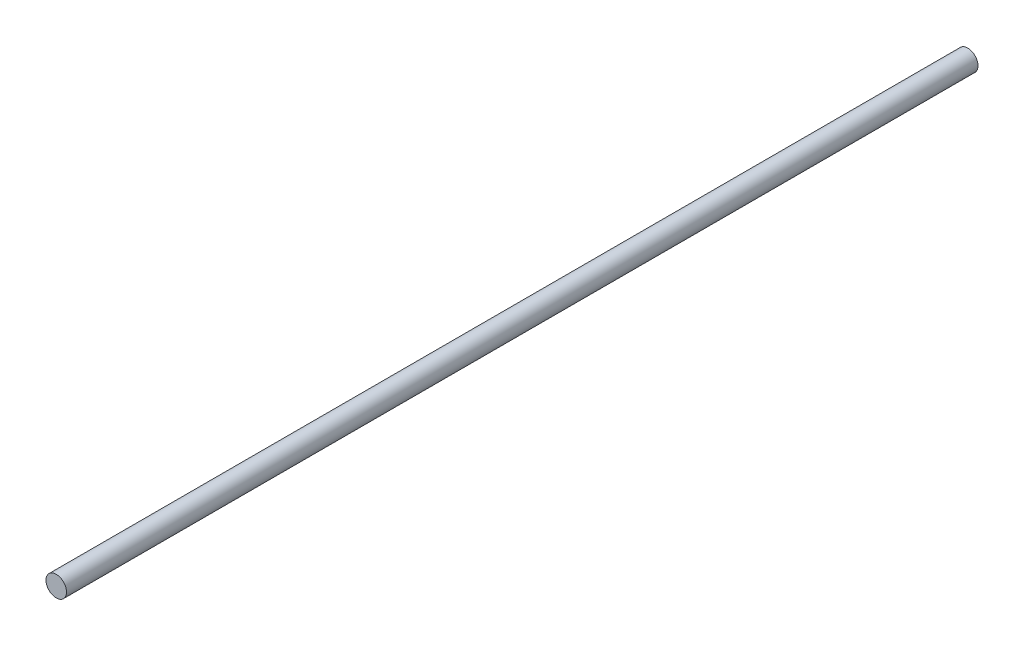
ISO-10303-21;
HEADER;
FILE_DESCRIPTION(('STEP AP214'),'2;1');
FILE_NAME('part.step','',(''),(''),'','','');
FILE_SCHEMA(('AUTOMOTIVE_DESIGN { 1 0 10303 214 1 1 1 1 }'));
ENDSEC;
DATA;
#1=APPLICATION_CONTEXT('core data for automotive mechanical design processes');
#2=APPLICATION_PROTOCOL_DEFINITION('international standard','automotive_design',2000,#1);
#3=PRODUCT_CONTEXT('',#1,'mechanical');
#4=PRODUCT('Part','Part','',(#3));
#5=PRODUCT_RELATED_PRODUCT_CATEGORY('part','',(#4));
#6=PRODUCT_DEFINITION_FORMATION('','',#4);
#7=PRODUCT_DEFINITION_CONTEXT('part definition',#1,'design');
#8=PRODUCT_DEFINITION('design','',#6,#7);
#9=PRODUCT_DEFINITION_SHAPE('','',#8);
#10=(LENGTH_UNIT() NAMED_UNIT(*) SI_UNIT(.MILLI.,.METRE.));
#11=(NAMED_UNIT(*) PLANE_ANGLE_UNIT() SI_UNIT($,.RADIAN.));
#12=(NAMED_UNIT(*) SI_UNIT($,.STERADIAN.) SOLID_ANGLE_UNIT());
#13=UNCERTAINTY_MEASURE_WITH_UNIT(LENGTH_MEASURE(1.E-05),#10,'distance_accuracy_value','');
#14=(GEOMETRIC_REPRESENTATION_CONTEXT(3) GLOBAL_UNCERTAINTY_ASSIGNED_CONTEXT((#13)) GLOBAL_UNIT_ASSIGNED_CONTEXT((#10,
#11,#12)) REPRESENTATION_CONTEXT('',''));
#15=CARTESIAN_POINT('',(0.,0.,0.));
#16=DIRECTION('',(0.,0.,1.));
#17=DIRECTION('',(1.,0.,0.));
#18=AXIS2_PLACEMENT_3D('',#15,#16,#17);
#19=CARTESIAN_POINT('',(0.,0.,35.));
#20=DIRECTION('',(0.,0.,-1.));
#21=DIRECTION('',(-1.,0.,0.));
#22=AXIS2_PLACEMENT_3D('',#19,#20,#21);
#23=CYLINDRICAL_SURFACE('',#22,0.3937008);
#24=CARTESIAN_POINT('',(0.,0.,35.));
#25=DIRECTION('',(0.,0.,1.));
#26=DIRECTION('',(1.,0.,0.));
#27=AXIS2_PLACEMENT_3D('',#24,#25,#26);
#28=CIRCLE('',#27,0.3937008);
#29=CARTESIAN_POINT('',(0.3937008,0.,35.));
#30=VERTEX_POINT('',#29);
#31=EDGE_CURVE('E10',#30,#30,#28,.T.);
#32=ORIENTED_EDGE('',*,*,#31,.F.);
#33=EDGE_LOOP('',(#32));
#34=FACE_BOUND('',#33,.T.);
#35=CARTESIAN_POINT('',(0.,0.,0.));
#36=DIRECTION('',(0.,0.,1.));
#37=DIRECTION('',(1.,0.,0.));
#38=AXIS2_PLACEMENT_3D('',#35,#36,#37);
#39=CIRCLE('',#38,0.3937008);
#40=CARTESIAN_POINT('',(0.3937008,0.,0.));
#41=VERTEX_POINT('',#40);
#42=EDGE_CURVE('E34',#41,#41,#39,.T.);
#43=ORIENTED_EDGE('',*,*,#42,.T.);
#44=EDGE_LOOP('',(#43));
#45=FACE_BOUND('',#44,.T.);
#46=ADVANCED_FACE('F31',(#34,#45),#23,.T.);
#47=CARTESIAN_POINT('',(0.,0.,35.));
#48=DIRECTION('',(0.,0.,1.));
#49=DIRECTION('',(1.,0.,0.));
#50=AXIS2_PLACEMENT_3D('',#47,#48,#49);
#51=PLANE('',#50);
#52=ORIENTED_EDGE('',*,*,#31,.T.);
#53=EDGE_LOOP('',(#52));
#54=FACE_BOUND('',#53,.T.);
#55=ADVANCED_FACE('F46',(#54),#51,.T.);
#56=CARTESIAN_POINT('',(0.,0.,0.));
#57=DIRECTION('',(0.,0.,1.));
#58=DIRECTION('',(1.,0.,0.));
#59=AXIS2_PLACEMENT_3D('',#56,#57,#58);
#60=PLANE('',#59);
#61=ORIENTED_EDGE('',*,*,#42,.F.);
#62=EDGE_LOOP('',(#61));
#63=FACE_BOUND('',#62,.T.);
#64=ADVANCED_FACE('F44',(#63),#60,.F.);
#65=CLOSED_SHELL('',(#46,#55,#64));
#66=MANIFOLD_SOLID_BREP('B2',#65);
#67=ADVANCED_BREP_SHAPE_REPRESENTATION('',(#18,#66),#14);
#68=SHAPE_DEFINITION_REPRESENTATION(#9,#67);
ENDSEC;
END-ISO-10303-21;
